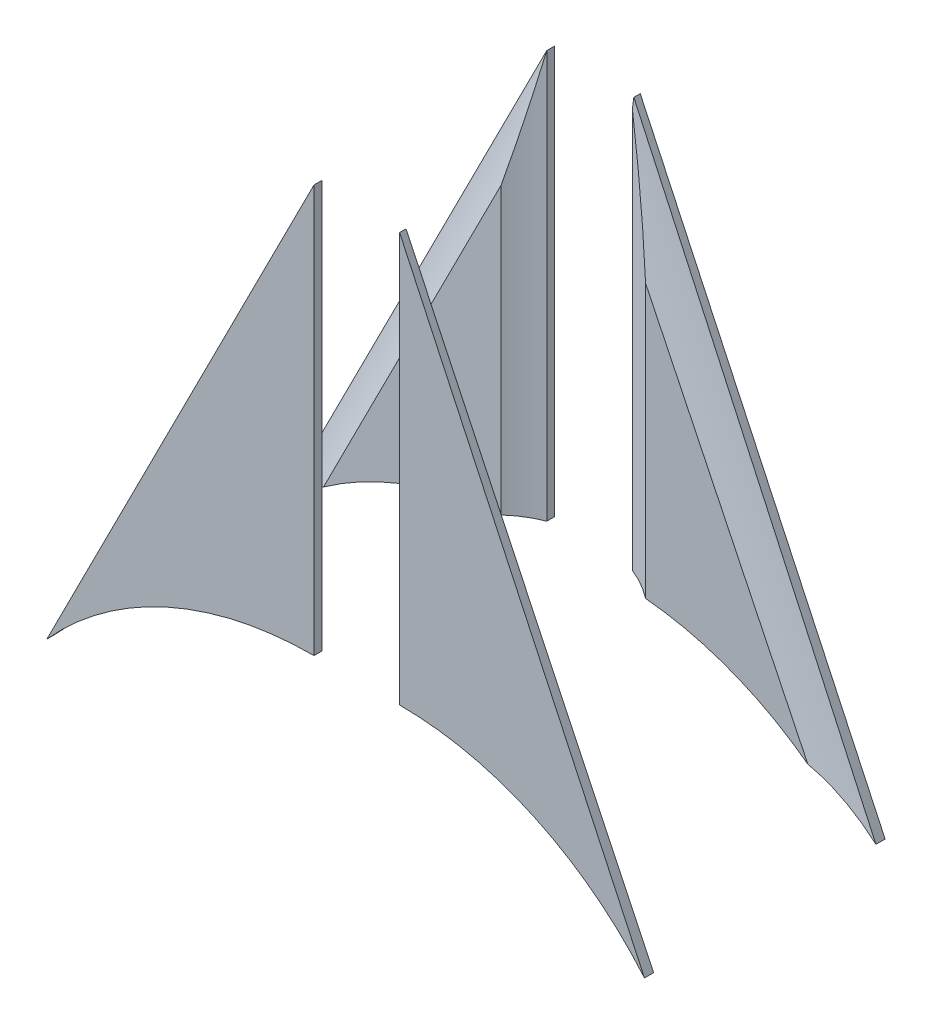
ISO-10303-21;
HEADER;
FILE_DESCRIPTION(('STEP AP214'),'2;1');
FILE_NAME('part.step','',(''),(''),'','','');
FILE_SCHEMA(('AUTOMOTIVE_DESIGN { 1 0 10303 214 1 1 1 1 }'));
ENDSEC;
DATA;
#1=APPLICATION_CONTEXT('core data for automotive mechanical design processes');
#2=APPLICATION_PROTOCOL_DEFINITION('international standard','automotive_design',2000,#1);
#3=PRODUCT_CONTEXT('',#1,'mechanical');
#4=PRODUCT('Part','Part','',(#3));
#5=PRODUCT_RELATED_PRODUCT_CATEGORY('part','',(#4));
#6=PRODUCT_DEFINITION_FORMATION('','',#4);
#7=PRODUCT_DEFINITION_CONTEXT('part definition',#1,'design');
#8=PRODUCT_DEFINITION('design','',#6,#7);
#9=PRODUCT_DEFINITION_SHAPE('','',#8);
#10=(LENGTH_UNIT() NAMED_UNIT(*) SI_UNIT(.MILLI.,.METRE.));
#11=(NAMED_UNIT(*) PLANE_ANGLE_UNIT() SI_UNIT($,.RADIAN.));
#12=(NAMED_UNIT(*) SI_UNIT($,.STERADIAN.) SOLID_ANGLE_UNIT());
#13=UNCERTAINTY_MEASURE_WITH_UNIT(LENGTH_MEASURE(1.E-05),#10,'distance_accuracy_value','');
#14=(GEOMETRIC_REPRESENTATION_CONTEXT(3) GLOBAL_UNCERTAINTY_ASSIGNED_CONTEXT((#13)) GLOBAL_UNIT_ASSIGNED_CONTEXT((#10,
#11,#12)) REPRESENTATION_CONTEXT('',''));
#15=CARTESIAN_POINT('',(0.,0.,0.));
#16=DIRECTION('',(0.,0.,1.));
#17=DIRECTION('',(1.,0.,0.));
#18=AXIS2_PLACEMENT_3D('',#15,#16,#17);
#19=CARTESIAN_POINT('',(-2.82222222222222,-23.6708987466304,-7.9375));
#20=DIRECTION('',(0.,0.,1.));
#21=DIRECTION('',(-1.,0.,0.));
#22=AXIS2_PLACEMENT_3D('',#19,#20,#21);
#23=CYLINDRICAL_SURFACE('',#22,23.6708987466304);
#24=CARTESIAN_POINT('',(-2.82222222222222,-23.6708987466304,-6.35));
#25=DIRECTION('',(0.,0.,-1.));
#26=DIRECTION('',(1.,0.,0.));
#27=AXIS2_PLACEMENT_3D('',#24,#25,#26);
#28=CIRCLE('',#27,23.6708987466304);
#29=CARTESIAN_POINT('',(-16.4791686957638,-4.33700983384184,-6.35));
#30=VERTEX_POINT('',#29);
#31=CARTESIAN_POINT('',(-4.76249999999998,-0.0796552520985656,-6.35));
#32=VERTEX_POINT('',#31);
#33=EDGE_CURVE('E164',#30,#32,#28,.T.);
#34=ORIENTED_EDGE('',*,*,#33,.F.);
#35=CARTESIAN_POINT('',(-16.4791686957638,-4.33700983384184,-6.35));
#36=CARTESIAN_POINT('',(-16.6545284019154,-4.46086256009777,-6.42526611649418));
#37=CARTESIAN_POINT('',(-16.8295827648747,-4.58810814889428,-6.49551543105102));
#38=CARTESIAN_POINT('',(-17.1782247201463,-4.8490006228776,-6.62690727443521));
#39=CARTESIAN_POINT('',(-17.3518128676449,-4.98264494439959,-6.68805341077926));
#40=CARTESIAN_POINT('',(-17.6957006735763,-5.25517272376629,-6.80185792004279));
#41=CARTESIAN_POINT('',(-17.8660142821283,-5.39401708588726,-6.85456821115581));
#42=CARTESIAN_POINT('',(-18.2039122553321,-5.67746431695201,-6.95283117131451));
#43=CARTESIAN_POINT('',(-18.3714963525424,-5.82206774545189,-6.99838314271435));
#44=CARTESIAN_POINT('',(-18.7033442952519,-6.11667925214695,-7.08309537285121));
#45=CARTESIAN_POINT('',(-18.8676096514688,-6.26668478059766,-7.12225859997793));
#46=CARTESIAN_POINT('',(-19.1924954410512,-6.57191380818712,-7.1949387527441));
#47=CARTESIAN_POINT('',(-19.3531158584304,-6.72713733020407,-7.22845565362345));
#48=CARTESIAN_POINT('',(-19.6714072921434,-7.0435991512527,-7.2907025165833));
#49=CARTESIAN_POINT('',(-19.8290521499642,-7.20487014732424,-7.31939973909409));
#50=CARTESIAN_POINT('',(-20.1400025297195,-7.53222029190118,-7.37232020329811));
#51=CARTESIAN_POINT('',(-20.2933085931518,-7.69829883512661,-7.39654400539452));
#52=CARTESIAN_POINT('',(-20.4443149669744,-7.86668112067436,-7.41882524354934));
#53=B_SPLINE_CURVE_WITH_KNOTS('',3,(#35,#36,#37,#38,#39,#40,#41,#42,#43,#44,#45,#46,#47,#48,#49,
#50,#51,#52),.UNSPECIFIED.,.F.,.F.,(4,2,2,2,2,2,2,2,4),(0.,0.682345221520637,1.36441931114423,
2.04211918016613,2.71988505653173,3.39733512138152,4.07478815688685,4.75667165985288,
5.43846968252621),.UNSPECIFIED.);
#54=CARTESIAN_POINT('',(-20.4443149669744,-7.86668112067437,-7.41882524354934));
#55=VERTEX_POINT('',#54);
#56=EDGE_CURVE('E134',#30,#55,#53,.T.);
#57=ORIENTED_EDGE('',*,*,#56,.T.);
#58=DIRECTION('',(0.,0.,1.));
#59=VECTOR('',#58,1.);
#60=CARTESIAN_POINT('',(-20.4443149669744,-7.86668112067437,-7.9375));
#61=LINE('',#60,#59);
#62=CARTESIAN_POINT('',(-20.4443149669744,-7.86668112067437,-7.9375));
#63=VERTEX_POINT('',#62);
#64=EDGE_CURVE('E132',#63,#55,#61,.T.);
#65=ORIENTED_EDGE('',*,*,#64,.F.);
#66=CARTESIAN_POINT('',(-2.82222222222222,-23.6708987466304,-7.9375));
#67=DIRECTION('',(0.,0.,-1.));
#68=DIRECTION('',(1.,0.,0.));
#69=AXIS2_PLACEMENT_3D('',#66,#67,#68);
#70=CIRCLE('',#69,23.6708987466304);
#71=CARTESIAN_POINT('',(-2.8222222222222,0.,-7.9375));
#72=VERTEX_POINT('',#71);
#73=EDGE_CURVE('E170',#63,#72,#70,.T.);
#74=ORIENTED_EDGE('',*,*,#73,.T.);
#75=DIRECTION('',(0.,0.,1.));
#76=VECTOR('',#75,1.);
#77=CARTESIAN_POINT('',(-2.8222222222222,0.,-7.9375));
#78=LINE('',#77,#76);
#79=CARTESIAN_POINT('',(-2.82222222222227,0.,-7.4188252424757));
#80=VERTEX_POINT('',#79);
#81=EDGE_CURVE('E149',#72,#80,#78,.T.);
#82=ORIENTED_EDGE('',*,*,#81,.T.);
#83=CARTESIAN_POINT('',(-2.8222222222222,0.,-7.41882524247573));
#84=CARTESIAN_POINT('',(-2.99592523344588,1.00011979534775E-05,-7.35276051486964));
#85=CARTESIAN_POINT('',(-3.16728898237306,-0.00191200073882721,-7.28057429104864));
#86=CARTESIAN_POINT('',(-3.50360817586906,-0.00921692854689364,-7.1247982334665));
#87=CARTESIAN_POINT('',(-3.668592022174,-0.0145820216710841,-7.04126889633603));
#88=CARTESIAN_POINT('',(-3.99222067000354,-0.0283777587901366,-6.86295973725627));
#89=CARTESIAN_POINT('',(-4.15086560637183,-0.0368083375362568,-6.76818015479693));
#90=CARTESIAN_POINT('',(-4.46185653505691,-0.0563371239536801,-6.56736046687277));
#91=CARTESIAN_POINT('',(-4.61416576454038,-0.0674488839122998,-6.46126473369188));
#92=CARTESIAN_POINT('',(-4.76249999999998,-0.0796552520985691,-6.35));
#93=B_SPLINE_CURVE_WITH_KNOTS('',3,(#83,#84,#85,#86,#87,#88,#89,#90,#91,#92),.UNSPECIFIED.,.F.,
.F.,(4,2,2,2,4),(0.,0.557386699182837,1.11190958059044,1.66642065969102,2.2237955496453),.UNSPECIFIED.);
#94=EDGE_CURVE('E140',#80,#32,#93,.T.);
#95=ORIENTED_EDGE('',*,*,#94,.T.);
#96=EDGE_LOOP('',(#34,#57,#65,#74,#82,#95));
#97=FACE_BOUND('',#96,.T.);
#98=ADVANCED_FACE('F68',(#97),#23,.F.);
#99=CARTESIAN_POINT('',(-2.82222222222222,26.8878111520368,-7.9375));
#100=DIRECTION('',(-1.,0.,0.));
#101=DIRECTION('',(0.,-1.,0.));
#102=AXIS2_PLACEMENT_3D('',#99,#100,#101);
#103=PLANE('',#102);
#104=DIRECTION('',(0.,0.,1.));
#105=VECTOR('',#104,1.);
#106=CARTESIAN_POINT('',(-2.82222222222222,26.8878111520368,-7.9375));
#107=LINE('',#106,#105);
#108=CARTESIAN_POINT('',(-2.82222222222222,26.8878111520368,-7.9375));
#109=VERTEX_POINT('',#108);
#110=CARTESIAN_POINT('',(-2.82222221939997,26.8878111576029,-7.41882524354934));
#111=VERTEX_POINT('',#110);
#112=EDGE_CURVE('E129',#109,#111,#107,.T.);
#113=ORIENTED_EDGE('',*,*,#112,.T.);
#114=DIRECTION('',(0.,-1.,0.));
#115=VECTOR('',#114,1.);
#116=CARTESIAN_POINT('',(-2.82222222222226,86.2990422935179,-7.4188252424757));
#117=LINE('',#116,#115);
#118=EDGE_CURVE('E137',#111,#80,#117,.T.);
#119=ORIENTED_EDGE('',*,*,#118,.T.);
#120=ORIENTED_EDGE('',*,*,#81,.F.);
#121=DIRECTION('',(0.,1.,0.));
#122=VECTOR('',#121,1.);
#123=CARTESIAN_POINT('',(-2.82222222222222,26.8878111520368,-7.9375));
#124=LINE('',#123,#122);
#125=EDGE_CURVE('E147',#72,#109,#124,.T.);
#126=ORIENTED_EDGE('',*,*,#125,.T.);
#127=EDGE_LOOP('',(#113,#119,#120,#126));
#128=FACE_BOUND('',#127,.T.);
#129=ADVANCED_FACE('F146',(#128),#103,.F.);
#130=CARTESIAN_POINT('',(-20.4443149669744,-7.86668112067437,-7.9375));
#131=DIRECTION('',(0.891899679684326,-0.452233304146207,0.));
#132=DIRECTION('',(0.452233304146207,0.891899679684326,0.));
#133=AXIS2_PLACEMENT_3D('',#130,#131,#132);
#134=PLANE('',#133);
#135=ORIENTED_EDGE('',*,*,#64,.T.);
#136=DIRECTION('',(-0.452233304146207,-0.891899679684326,0.));
#137=VECTOR('',#136,1.);
#138=CARTESIAN_POINT('',(2.51713909348085,37.4181604286899,-7.41882524354934));
#139=LINE('',#138,#137);
#140=EDGE_CURVE('E121',#55,#111,#139,.F.);
#141=ORIENTED_EDGE('',*,*,#140,.T.);
#142=ORIENTED_EDGE('',*,*,#112,.F.);
#143=DIRECTION('',(-0.452233304146207,-0.891899679684326,0.));
#144=VECTOR('',#143,1.);
#145=CARTESIAN_POINT('',(-20.4443149669744,-7.86668112067437,-7.9375));
#146=LINE('',#145,#144);
#147=EDGE_CURVE('E97',#109,#63,#146,.T.);
#148=ORIENTED_EDGE('',*,*,#147,.T.);
#149=EDGE_LOOP('',(#135,#141,#142,#148));
#150=FACE_BOUND('',#149,.T.);
#151=ADVANCED_FACE('F127',(#150),#134,.F.);
#152=CARTESIAN_POINT('',(-2.82222222222222,-23.6708987466304,-7.9375));
#153=DIRECTION('',(0.,0.,-1.));
#154=DIRECTION('',(1.,0.,0.));
#155=AXIS2_PLACEMENT_3D('',#152,#153,#154);
#156=PLANE('',#155);
#157=ORIENTED_EDGE('',*,*,#73,.F.);
#158=ORIENTED_EDGE('',*,*,#147,.F.);
#159=ORIENTED_EDGE('',*,*,#125,.F.);
#160=EDGE_LOOP('',(#157,#158,#159));
#161=FACE_BOUND('',#160,.T.);
#162=ADVANCED_FACE('F184',(#161),#156,.T.);
#163=CARTESIAN_POINT('',(-2.82222222222222,-23.6708987466304,-6.35));
#164=DIRECTION('',(0.,0.,-1.));
#165=DIRECTION('',(1.,0.,0.));
#166=AXIS2_PLACEMENT_3D('',#163,#164,#165);
#167=PLANE('',#166);
#168=DIRECTION('',(0.,-1.,0.));
#169=VECTOR('',#168,1.);
#170=CARTESIAN_POINT('',(-4.76249999999997,86.2990422935179,-6.35));
#171=LINE('',#170,#169);
#172=CARTESIAN_POINT('',(-4.76249999999998,18.7707377842783,-6.35));
#173=VERTEX_POINT('',#172);
#174=EDGE_CURVE('E77',#32,#173,#171,.F.);
#175=ORIENTED_EDGE('',*,*,#174,.T.);
#176=DIRECTION('',(-0.452233304146207,-0.891899679684326,0.));
#177=VECTOR('',#176,1.);
#178=CARTESIAN_POINT('',(4.2476722244966,36.5407021970077,-6.35));
#179=LINE('',#178,#177);
#180=EDGE_CURVE('E87',#173,#30,#179,.T.);
#181=ORIENTED_EDGE('',*,*,#180,.T.);
#182=ORIENTED_EDGE('',*,*,#33,.T.);
#183=EDGE_LOOP('',(#175,#181,#182));
#184=FACE_BOUND('',#183,.T.);
#185=ADVANCED_FACE('F162',(#184),#167,.F.);
#186=CARTESIAN_POINT('',(0.,86.2990422935179,0.));
#187=DIRECTION('',(0.,-1.,0.));
#188=DIRECTION('',(1.,0.,0.));
#189=AXIS2_PLACEMENT_3D('',#186,#187,#188);
#190=CYLINDRICAL_SURFACE('',#189,7.9375);
#191=ORIENTED_EDGE('',*,*,#118,.F.);
#192=CARTESIAN_POINT('',(0.,38.694463308004,0.));
#193=DIRECTION('',(0.972599526959664,-0.232486903196367,0.));
#194=DIRECTION('',(-0.232486903196367,-0.972599526959664,0.));
#195=AXIS2_PLACEMENT_3D('',#192,#193,#194);
#196=ELLIPSE('',#195,34.1417081602042,7.9375);
#197=EDGE_CURVE('E13',#111,#173,#196,.F.);
#198=ORIENTED_EDGE('',*,*,#197,.T.);
#199=ORIENTED_EDGE('',*,*,#174,.F.);
#200=ORIENTED_EDGE('',*,*,#94,.F.);
#201=EDGE_LOOP('',(#191,#198,#199,#200));
#202=FACE_BOUND('',#201,.T.);
#203=ADVANCED_FACE('F138',(#202),#190,.F.);
#204=CARTESIAN_POINT('',(0.,38.694463308004,0.));
#205=DIRECTION('',(-0.452233304146207,-0.891899679684326,0.));
#206=DIRECTION('',(0.891899679684326,-0.452233304146207,0.));
#207=AXIS2_PLACEMENT_3D('',#204,#205,#206);
#208=CYLINDRICAL_SURFACE('',#207,7.9375);
#209=ORIENTED_EDGE('',*,*,#180,.F.);
#210=ORIENTED_EDGE('',*,*,#197,.F.);
#211=ORIENTED_EDGE('',*,*,#140,.F.);
#212=ORIENTED_EDGE('',*,*,#56,.F.);
#213=EDGE_LOOP('',(#209,#210,#211,#212));
#214=FACE_BOUND('',#213,.T.);
#215=ADVANCED_FACE('F120',(#214),#208,.F.);
#216=CLOSED_SHELL('',(#98,#129,#151,#162,#185,#203,#215));
#217=MANIFOLD_SOLID_BREP('B2',#216);
#218=CARTESIAN_POINT('',(2.82222222222222,-21.114080449228,-7.9375));
#219=DIRECTION('',(0.,0.,1.));
#220=DIRECTION('',(-1.,0.,0.));
#221=AXIS2_PLACEMENT_3D('',#218,#219,#220);
#222=CYLINDRICAL_SURFACE('',#221,21.114080449228);
#223=DIRECTION('',(0.,0.,1.));
#224=VECTOR('',#223,1.);
#225=CARTESIAN_POINT('',(18.976219439284,-7.51802340581895,-7.9375));
#226=LINE('',#225,#224);
#227=CARTESIAN_POINT('',(18.976219439284,-7.51802340581895,-7.9375));
#228=VERTEX_POINT('',#227);
#229=CARTESIAN_POINT('',(18.976219439284,-7.51802340581895,-7.33049476941848));
#230=VERTEX_POINT('',#229);
#231=EDGE_CURVE('E326',#228,#230,#226,.T.);
#232=ORIENTED_EDGE('',*,*,#231,.T.);
#233=CARTESIAN_POINT('',(18.976219439284,-7.51802340581895,-7.33049476941848));
#234=CARTESIAN_POINT('',(18.8437164971824,-7.36058548627625,-7.30942358651429));
#235=CARTESIAN_POINT('',(18.7090180445645,-7.2052226059667,-7.28656240073076));
#236=CARTESIAN_POINT('',(18.4354661900463,-6.89883713218853,-7.23677924927139));
#237=CARTESIAN_POINT('',(18.296612326124,-6.74781502503866,-7.20985683069004));
#238=CARTESIAN_POINT('',(18.0159133048431,-6.45128507586411,-7.1516610850989));
#239=CARTESIAN_POINT('',(17.8740928704587,-6.30574821021713,-7.12041659949753));
#240=CARTESIAN_POINT('',(17.5869147721722,-6.01940060058214,-7.05291117352708));
#241=CARTESIAN_POINT('',(17.4415571307033,-5.87858982663457,-7.0166502649655));
#242=CARTESIAN_POINT('',(17.1475999737529,-5.60186901299707,-6.93850898765317));
#243=CARTESIAN_POINT('',(16.9989991956328,-5.46596093872596,-6.89662639633039));
#244=CARTESIAN_POINT('',(16.6990510155313,-5.19936142530037,-6.80661286644771));
#245=CARTESIAN_POINT('',(16.5477038339178,-5.06866957027185,-6.7584824273169));
#246=CARTESIAN_POINT('',(16.2417866175542,-4.81194039734671,-6.65495131170017));
#247=CARTESIAN_POINT('',(16.0872022274714,-4.68593787120068,-6.59950644621144));
#248=CARTESIAN_POINT('',(15.7763512890853,-4.43971719426204,-6.48080318633887));
#249=CARTESIAN_POINT('',(15.620084201091,-4.31950097128188,-6.41754221257428));
#250=CARTESIAN_POINT('',(15.463328249719,-4.20234394412428,-6.35));
#251=B_SPLINE_CURVE_WITH_KNOTS('',3,(#233,#234,#235,#236,#237,#238,#239,#240,#241,#242,#243,
#244,#245,#246,#247,#248,#249,#250),.UNSPECIFIED.,.F.,.F.,(4,2,2,2,2,2,2,2,4),(0.,
0.620540139430094,1.24114953224086,1.85780118858621,2.47444893512351,3.09134119977859,
3.70818418275462,4.32894075948304,4.94990274096788),.UNSPECIFIED.);
#252=CARTESIAN_POINT('',(15.4633282497189,-4.20234394412426,-6.35));
#253=VERTEX_POINT('',#252);
#254=EDGE_CURVE('E363',#230,#253,#251,.T.);
#255=ORIENTED_EDGE('',*,*,#254,.T.);
#256=CARTESIAN_POINT('',(2.82222222222222,-21.114080449228,-6.35));
#257=DIRECTION('',(0.,0.,-1.));
#258=DIRECTION('',(-1.,0.,0.));
#259=AXIS2_PLACEMENT_3D('',#256,#257,#258);
#260=CIRCLE('',#259,21.114080449228);
#261=CARTESIAN_POINT('',(4.76250000000002,-0.089339895263163,-6.35));
#262=VERTEX_POINT('',#261);
#263=EDGE_CURVE('E321',#262,#253,#260,.T.);
#264=ORIENTED_EDGE('',*,*,#263,.F.);
#265=CARTESIAN_POINT('',(4.76250000000002,-0.089339895263163,-6.35));
#266=CARTESIAN_POINT('',(4.61421358411622,-0.0756479632866591,-6.46122907788727));
#267=CARTESIAN_POINT('',(4.4619378595739,-0.0631845660562414,-6.56730464384498));
#268=CARTESIAN_POINT('',(4.15099596564056,-0.0412817521191013,-6.76809926139033));
#269=CARTESIAN_POINT('',(3.99236719307374,-0.0318269299498871,-6.86287456153188));
#270=CARTESIAN_POINT('',(3.668742745119,-0.0163549126635673,-7.04119029428164));
#271=CARTESIAN_POINT('',(3.50374689967418,-0.0103378094317618,-7.1247304265443));
#272=CARTESIAN_POINT('',(3.16737500902741,-0.00214462376370144,-7.28053801973534));
#273=CARTESIAN_POINT('',(2.99597009329015,1.11927930437792E-05,-7.35274419984045));
#274=CARTESIAN_POINT('',(2.82222222222222,0.,-7.41882524247574));
#275=B_SPLINE_CURVE_WITH_KNOTS('',3,(#265,#266,#267,#268,#269,#270,#271,#272,#273,#274),
.UNSPECIFIED.,.F.,.F.,(4,2,2,2,4),(0.,0.557509229948387,1.11211598819303,1.66673756958802,
2.22426163397649),.UNSPECIFIED.);
#276=CARTESIAN_POINT('',(2.82222222222223,0.,-7.41882524247574));
#277=VERTEX_POINT('',#276);
#278=EDGE_CURVE('E286',#262,#277,#275,.T.);
#279=ORIENTED_EDGE('',*,*,#278,.T.);
#280=DIRECTION('',(0.,0.,1.));
#281=VECTOR('',#280,1.);
#282=CARTESIAN_POINT('',(2.82222222222222,0.,-7.9375));
#283=LINE('',#282,#281);
#284=CARTESIAN_POINT('',(2.82222222222222,0.,-7.9375));
#285=VERTEX_POINT('',#284);
#286=EDGE_CURVE('E337',#285,#277,#283,.T.);
#287=ORIENTED_EDGE('',*,*,#286,.F.);
#288=CARTESIAN_POINT('',(2.82222222222222,-21.114080449228,-7.9375));
#289=DIRECTION('',(0.,0.,-1.));
#290=DIRECTION('',(-1.,0.,0.));
#291=AXIS2_PLACEMENT_3D('',#288,#289,#290);
#292=CIRCLE('',#291,21.114080449228);
#293=EDGE_CURVE('E344',#285,#228,#292,.T.);
#294=ORIENTED_EDGE('',*,*,#293,.T.);
#295=EDGE_LOOP('',(#232,#255,#264,#279,#287,#294));
#296=FACE_BOUND('',#295,.T.);
#297=ADVANCED_FACE('F257',(#296),#222,.F.);
#298=CARTESIAN_POINT('',(2.82222222222222,26.989428429131,-7.9375));
#299=DIRECTION('',(-0.90567437482675,-0.423973969462955,0.));
#300=DIRECTION('',(0.423973969462955,-0.90567437482675,0.));
#301=AXIS2_PLACEMENT_3D('',#298,#299,#300);
#302=PLANE('',#301);
#303=DIRECTION('',(0.,0.,1.));
#304=VECTOR('',#303,1.);
#305=CARTESIAN_POINT('',(2.82222222222222,26.989428429131,-7.9375));
#306=LINE('',#305,#304);
#307=CARTESIAN_POINT('',(2.82222222222222,26.989428429131,-7.9375));
#308=VERTEX_POINT('',#307);
#309=CARTESIAN_POINT('',(2.82222222222222,26.989428429131,-7.51428455318159));
#310=VERTEX_POINT('',#309);
#311=EDGE_CURVE('E331',#308,#310,#306,.T.);
#312=ORIENTED_EDGE('',*,*,#311,.T.);
#313=CARTESIAN_POINT('',(-81.9906245231497,208.162867097288,0.));
#314=DIRECTION('',(-0.90567437482675,-0.423973969462955,0.));
#315=DIRECTION('',(-0.423973969462955,0.905674374826751,0.));
#316=AXIS2_PLACEMENT_3D('',#313,#314,#315);
#317=ELLIPSE('',#316,620.920656994149,7.93749999999999);
#318=EDGE_CURVE('E393',#310,#230,#317,.T.);
#319=ORIENTED_EDGE('',*,*,#318,.T.);
#320=ORIENTED_EDGE('',*,*,#231,.F.);
#321=DIRECTION('',(-0.423973969462955,0.90567437482675,0.));
#322=VECTOR('',#321,1.);
#323=CARTESIAN_POINT('',(2.82222222222222,26.989428429131,-7.9375));
#324=LINE('',#323,#322);
#325=EDGE_CURVE('E348',#228,#308,#324,.T.);
#326=ORIENTED_EDGE('',*,*,#325,.T.);
#327=EDGE_LOOP('',(#312,#319,#320,#326));
#328=FACE_BOUND('',#327,.T.);
#329=ADVANCED_FACE('F382',(#328),#302,.F.);
#330=CARTESIAN_POINT('',(2.82222222222222,0.,-7.9375));
#331=DIRECTION('',(1.,0.,0.));
#332=DIRECTION('',(0.,0.,1.));
#333=AXIS2_PLACEMENT_3D('',#330,#331,#332);
#334=PLANE('',#333);
#335=DIRECTION('',(0.,-1.,0.));
#336=VECTOR('',#335,1.);
#337=CARTESIAN_POINT('',(2.82222222222222,86.2990422935179,-7.41882524247574));
#338=LINE('',#337,#336);
#339=CARTESIAN_POINT('',(2.82222222222221,26.380977873178,-7.41882524247574));
#340=VERTEX_POINT('',#339);
#341=EDGE_CURVE('E345',#277,#340,#338,.F.);
#342=ORIENTED_EDGE('',*,*,#341,.T.);
#343=CARTESIAN_POINT('',(2.82222222222224,32.8611439752111,0.));
#344=DIRECTION('',(1.,0.,0.));
#345=DIRECTION('',(0.,1.,0.));
#346=AXIS2_PLACEMENT_3D('',#343,#344,#345);
#347=ELLIPSE('',#346,18.2254671619682,7.93749999999999);
#348=EDGE_CURVE('E276',#340,#310,#347,.T.);
#349=ORIENTED_EDGE('',*,*,#348,.T.);
#350=ORIENTED_EDGE('',*,*,#311,.F.);
#351=DIRECTION('',(0.,-1.,0.));
#352=VECTOR('',#351,1.);
#353=CARTESIAN_POINT('',(2.82222222222222,0.,-7.9375));
#354=LINE('',#353,#352);
#355=EDGE_CURVE('E341',#308,#285,#354,.T.);
#356=ORIENTED_EDGE('',*,*,#355,.T.);
#357=ORIENTED_EDGE('',*,*,#286,.T.);
#358=EDGE_LOOP('',(#342,#349,#350,#356,#357));
#359=FACE_BOUND('',#358,.T.);
#360=ADVANCED_FACE('F377',(#359),#334,.F.);
#361=CARTESIAN_POINT('',(2.82222222222222,-21.114080449228,-7.9375));
#362=DIRECTION('',(0.,0.,1.));
#363=DIRECTION('',(-1.,0.,0.));
#364=AXIS2_PLACEMENT_3D('',#361,#362,#363);
#365=PLANE('',#364);
#366=ORIENTED_EDGE('',*,*,#293,.F.);
#367=ORIENTED_EDGE('',*,*,#355,.F.);
#368=ORIENTED_EDGE('',*,*,#325,.F.);
#369=EDGE_LOOP('',(#366,#367,#368));
#370=FACE_BOUND('',#369,.T.);
#371=ADVANCED_FACE('F374',(#370),#365,.F.);
#372=CARTESIAN_POINT('',(2.82222222222222,-21.114080449228,-6.35));
#373=DIRECTION('',(0.,0.,1.));
#374=DIRECTION('',(-1.,0.,0.));
#375=AXIS2_PLACEMENT_3D('',#372,#373,#374);
#376=PLANE('',#375);
#377=DIRECTION('',(-0.435516957094164,0.900180526385369,0.));
#378=VECTOR('',#377,1.);
#379=CARTESIAN_POINT('',(109.884939270642,-199.364654220351,-6.35));
#380=LINE('',#379,#378);
#381=CARTESIAN_POINT('',(4.76250000000003,17.9154566367351,-6.35));
#382=VERTEX_POINT('',#381);
#383=EDGE_CURVE('E314',#382,#253,#380,.F.);
#384=ORIENTED_EDGE('',*,*,#383,.F.);
#385=DIRECTION('',(0.,-1.,0.));
#386=VECTOR('',#385,1.);
#387=CARTESIAN_POINT('',(4.76250000000003,86.2990422935179,-6.35));
#388=LINE('',#387,#386);
#389=EDGE_CURVE('E266',#262,#382,#388,.F.);
#390=ORIENTED_EDGE('',*,*,#389,.F.);
#391=ORIENTED_EDGE('',*,*,#263,.T.);
#392=EDGE_LOOP('',(#384,#390,#391));
#393=FACE_BOUND('',#392,.T.);
#394=ADVANCED_FACE('F319',(#393),#376,.T.);
#395=CARTESIAN_POINT('',(0.,86.2990422935179,0.));
#396=DIRECTION('',(0.,-1.,0.));
#397=DIRECTION('',(1.,0.,0.));
#398=AXIS2_PLACEMENT_3D('',#395,#396,#397);
#399=CYLINDRICAL_SURFACE('',#398,7.9375);
#400=ORIENTED_EDGE('',*,*,#389,.T.);
#401=CARTESIAN_POINT('',(0.,38.6944633080038,0.));
#402=DIRECTION('',(-0.974725737421909,-0.223404871941763,0.));
#403=DIRECTION('',(0.223404871941763,-0.974725737421909,0.));
#404=AXIS2_PLACEMENT_3D('',#401,#402,#403);
#405=ELLIPSE('',#404,35.5296638386165,7.9375);
#406=EDGE_CURVE('E66',#382,#340,#405,.F.);
#407=ORIENTED_EDGE('',*,*,#406,.T.);
#408=ORIENTED_EDGE('',*,*,#341,.F.);
#409=ORIENTED_EDGE('',*,*,#278,.F.);
#410=EDGE_LOOP('',(#400,#407,#408,#409));
#411=FACE_BOUND('',#410,.T.);
#412=ADVANCED_FACE('F324',(#411),#399,.F.);
#413=CARTESIAN_POINT('',(114.172049027553,-197.29050471219,0.));
#414=DIRECTION('',(-0.435516957094164,0.900180526385369,0.));
#415=DIRECTION('',(-0.900180526385369,-0.435516957094164,0.));
#416=AXIS2_PLACEMENT_3D('',#413,#414,#415);
#417=CYLINDRICAL_SURFACE('',#416,7.93749999999999);
#418=ORIENTED_EDGE('',*,*,#318,.F.);
#419=ORIENTED_EDGE('',*,*,#348,.F.);
#420=ORIENTED_EDGE('',*,*,#406,.F.);
#421=ORIENTED_EDGE('',*,*,#383,.T.);
#422=ORIENTED_EDGE('',*,*,#254,.F.);
#423=EDGE_LOOP('',(#418,#419,#420,#421,#422));
#424=FACE_BOUND('',#423,.T.);
#425=ADVANCED_FACE('F313',(#424),#417,.F.);
#426=CLOSED_SHELL('',(#297,#329,#360,#371,#394,#412,#425));
#427=MANIFOLD_SOLID_BREP('B7',#426);
#428=CARTESIAN_POINT('',(2.82222222222222,-21.114080449228,7.9375));
#429=DIRECTION('',(0.,0.,-1.));
#430=DIRECTION('',(-1.,0.,0.));
#431=AXIS2_PLACEMENT_3D('',#428,#429,#430);
#432=CYLINDRICAL_SURFACE('',#431,21.114080449228);
#433=CARTESIAN_POINT('',(2.82222222222222,-21.114080449228,6.35));
#434=DIRECTION('',(0.,0.,-1.));
#435=DIRECTION('',(-1.,0.,0.));
#436=AXIS2_PLACEMENT_3D('',#433,#434,#435);
#437=CIRCLE('',#436,21.114080449228);
#438=CARTESIAN_POINT('',(4.76250000000002,-0.089339895263163,6.35));
#439=VERTEX_POINT('',#438);
#440=CARTESIAN_POINT('',(15.4633282497189,-4.20234394412426,6.35));
#441=VERTEX_POINT('',#440);
#442=EDGE_CURVE('E534',#439,#441,#437,.T.);
#443=ORIENTED_EDGE('',*,*,#442,.T.);
#444=CARTESIAN_POINT('',(15.463328249719,-4.20234394412428,6.35));
#445=CARTESIAN_POINT('',(15.620084201091,-4.31950097128188,6.41754221257428));
#446=CARTESIAN_POINT('',(15.7763512890853,-4.43971719426204,6.48080318633887));
#447=CARTESIAN_POINT('',(16.0872022274714,-4.68593787120068,6.59950644621144));
#448=CARTESIAN_POINT('',(16.2417866175542,-4.8119403973467,6.65495131170017));
#449=CARTESIAN_POINT('',(16.5477038339178,-5.06866957027184,6.7584824273169));
#450=CARTESIAN_POINT('',(16.6990510155313,-5.19936142530036,6.80661286644772));
#451=CARTESIAN_POINT('',(16.9989991956328,-5.46596093872596,6.8966263963304));
#452=CARTESIAN_POINT('',(17.1475999737529,-5.60186901299706,6.93850898765317));
#453=CARTESIAN_POINT('',(17.4415571307033,-5.87858982663457,7.0166502649655));
#454=CARTESIAN_POINT('',(17.5869147721722,-6.01940060058214,7.05291117352708));
#455=CARTESIAN_POINT('',(17.8740928704587,-6.30574821021713,7.12041659949753));
#456=CARTESIAN_POINT('',(18.0159133048431,-6.45128507586411,7.1516610850989));
#457=CARTESIAN_POINT('',(18.296612326124,-6.74781502503865,7.20985683069004));
#458=CARTESIAN_POINT('',(18.4354661900463,-6.89883713218852,7.2367792492714));
#459=CARTESIAN_POINT('',(18.7090180445645,-7.20522260596669,7.28656240073077));
#460=CARTESIAN_POINT('',(18.8437164971824,-7.36058548627625,7.3094235865143));
#461=CARTESIAN_POINT('',(18.976219439284,-7.51802340581895,7.33049476941848));
#462=B_SPLINE_CURVE_WITH_KNOTS('',3,(#444,#445,#446,#447,#448,#449,#450,#451,#452,#453,#454,
#455,#456,#457,#458,#459,#460,#461),.UNSPECIFIED.,.F.,.F.,(4,2,2,2,2,2,2,2,4),(0.,
0.620961981484838,1.24171855821326,1.85856154118929,2.47545380584438,3.09210155238167,
3.70875320872702,4.32936260153778,4.94990274096788),.UNSPECIFIED.);
#463=CARTESIAN_POINT('',(18.976219439284,-7.51802340581895,7.33049476941848));
#464=VERTEX_POINT('',#463);
#465=EDGE_CURVE('E541',#441,#464,#462,.T.);
#466=ORIENTED_EDGE('',*,*,#465,.T.);
#467=DIRECTION('',(0.,0.,-1.));
#468=VECTOR('',#467,1.);
#469=CARTESIAN_POINT('',(18.976219439284,-7.51802340581895,7.9375));
#470=LINE('',#469,#468);
#471=CARTESIAN_POINT('',(18.976219439284,-7.51802340581895,7.9375));
#472=VERTEX_POINT('',#471);
#473=EDGE_CURVE('E562',#472,#464,#470,.T.);
#474=ORIENTED_EDGE('',*,*,#473,.F.);
#475=CARTESIAN_POINT('',(2.82222222222222,-21.114080449228,7.9375));
#476=DIRECTION('',(0.,0.,-1.));
#477=DIRECTION('',(-1.,0.,0.));
#478=AXIS2_PLACEMENT_3D('',#475,#476,#477);
#479=CIRCLE('',#478,21.114080449228);
#480=CARTESIAN_POINT('',(2.82222222222222,0.,7.9375));
#481=VERTEX_POINT('',#480);
#482=EDGE_CURVE('E539',#481,#472,#479,.T.);
#483=ORIENTED_EDGE('',*,*,#482,.F.);
#484=DIRECTION('',(0.,0.,-1.));
#485=VECTOR('',#484,1.);
#486=CARTESIAN_POINT('',(2.82222222222222,0.,7.9375));
#487=LINE('',#486,#485);
#488=CARTESIAN_POINT('',(2.82222222222222,0.,7.41882524247574));
#489=VERTEX_POINT('',#488);
#490=EDGE_CURVE('E556',#481,#489,#487,.T.);
#491=ORIENTED_EDGE('',*,*,#490,.T.);
#492=CARTESIAN_POINT('',(2.82222222222222,0.,7.41882524247574));
#493=CARTESIAN_POINT('',(2.99597009329015,1.1192793039593E-05,7.35274419984046));
#494=CARTESIAN_POINT('',(3.1673750090274,-0.00214462376370555,7.28053801973535));
#495=CARTESIAN_POINT('',(3.50374689967418,-0.0103378094317634,7.1247304265443));
#496=CARTESIAN_POINT('',(3.668742745119,-0.0163549126635666,7.04119029428165));
#497=CARTESIAN_POINT('',(3.99236719307374,-0.0318269299498863,6.86287456153188));
#498=CARTESIAN_POINT('',(4.15099596564056,-0.0412817521191026,6.76809926139033));
#499=CARTESIAN_POINT('',(4.4619378595739,-0.0631845660562449,6.56730464384498));
#500=CARTESIAN_POINT('',(4.61421358411622,-0.0756479632866626,6.46122907788727));
#501=CARTESIAN_POINT('',(4.76250000000002,-0.0893398952631618,6.35));
#502=B_SPLINE_CURVE_WITH_KNOTS('',3,(#492,#493,#494,#495,#496,#497,#498,#499,#500,#501),
.UNSPECIFIED.,.F.,.F.,(4,2,2,2,4),(0.,0.557524064388471,1.11214564578346,1.6667524040281,
2.22426163397649),.UNSPECIFIED.);
#503=EDGE_CURVE('E531',#489,#439,#502,.T.);
#504=ORIENTED_EDGE('',*,*,#503,.T.);
#505=EDGE_LOOP('',(#443,#466,#474,#483,#491,#504));
#506=FACE_BOUND('',#505,.T.);
#507=ADVANCED_FACE('F457',(#506),#432,.F.);
#508=CARTESIAN_POINT('',(2.82222222222222,26.989428429131,7.9375));
#509=DIRECTION('',(-0.90567437482675,-0.423973969462955,0.));
#510=DIRECTION('',(0.423973969462955,-0.90567437482675,0.));
#511=AXIS2_PLACEMENT_3D('',#508,#509,#510);
#512=PLANE('',#511);
#513=ORIENTED_EDGE('',*,*,#473,.T.);
#514=CARTESIAN_POINT('',(-81.9906245231497,208.162867097288,0.));
#515=DIRECTION('',(-0.90567437482675,-0.423973969462955,0.));
#516=DIRECTION('',(-0.423973969462955,0.905674374826751,0.));
#517=AXIS2_PLACEMENT_3D('',#514,#515,#516);
#518=ELLIPSE('',#517,620.920656994149,7.93749999999999);
#519=CARTESIAN_POINT('',(2.82222222222222,26.989428429131,7.51428455318159));
#520=VERTEX_POINT('',#519);
#521=EDGE_CURVE('E527',#464,#520,#518,.T.);
#522=ORIENTED_EDGE('',*,*,#521,.T.);
#523=DIRECTION('',(0.,0.,-1.));
#524=VECTOR('',#523,1.);
#525=CARTESIAN_POINT('',(2.82222222222222,26.989428429131,7.9375));
#526=LINE('',#525,#524);
#527=CARTESIAN_POINT('',(2.82222222222222,26.989428429131,7.9375));
#528=VERTEX_POINT('',#527);
#529=EDGE_CURVE('E525',#528,#520,#526,.T.);
#530=ORIENTED_EDGE('',*,*,#529,.F.);
#531=DIRECTION('',(-0.423973969462955,0.90567437482675,0.));
#532=VECTOR('',#531,1.);
#533=CARTESIAN_POINT('',(2.82222222222222,26.989428429131,7.9375));
#534=LINE('',#533,#532);
#535=EDGE_CURVE('E552',#472,#528,#534,.T.);
#536=ORIENTED_EDGE('',*,*,#535,.F.);
#537=EDGE_LOOP('',(#513,#522,#530,#536));
#538=FACE_BOUND('',#537,.T.);
#539=ADVANCED_FACE('F593',(#538),#512,.F.);
#540=CARTESIAN_POINT('',(2.82222222222222,0.,7.9375));
#541=DIRECTION('',(1.,0.,0.));
#542=DIRECTION('',(0.,0.,-1.));
#543=AXIS2_PLACEMENT_3D('',#540,#541,#542);
#544=PLANE('',#543);
#545=ORIENTED_EDGE('',*,*,#529,.T.);
#546=CARTESIAN_POINT('',(2.82222222222224,32.8611439752111,0.));
#547=DIRECTION('',(1.,0.,0.));
#548=DIRECTION('',(0.,1.,0.));
#549=AXIS2_PLACEMENT_3D('',#546,#547,#548);
#550=ELLIPSE('',#549,18.2254671619682,7.93749999999999);
#551=CARTESIAN_POINT('',(2.82222222222221,26.380977873178,7.41882524247574));
#552=VERTEX_POINT('',#551);
#553=EDGE_CURVE('E514',#520,#552,#550,.T.);
#554=ORIENTED_EDGE('',*,*,#553,.T.);
#555=DIRECTION('',(0.,-1.,0.));
#556=VECTOR('',#555,1.);
#557=CARTESIAN_POINT('',(2.82222222222222,86.2990422935179,7.41882524247574));
#558=LINE('',#557,#556);
#559=EDGE_CURVE('E522',#552,#489,#558,.T.);
#560=ORIENTED_EDGE('',*,*,#559,.T.);
#561=ORIENTED_EDGE('',*,*,#490,.F.);
#562=DIRECTION('',(0.,-1.,0.));
#563=VECTOR('',#562,1.);
#564=CARTESIAN_POINT('',(2.82222222222222,0.,7.9375));
#565=LINE('',#564,#563);
#566=EDGE_CURVE('E486',#528,#481,#565,.T.);
#567=ORIENTED_EDGE('',*,*,#566,.F.);
#568=EDGE_LOOP('',(#545,#554,#560,#561,#567));
#569=FACE_BOUND('',#568,.T.);
#570=ADVANCED_FACE('F521',(#569),#544,.F.);
#571=CARTESIAN_POINT('',(2.82222222222222,-21.114080449228,7.9375));
#572=DIRECTION('',(0.,0.,-1.));
#573=DIRECTION('',(-1.,0.,0.));
#574=AXIS2_PLACEMENT_3D('',#571,#572,#573);
#575=PLANE('',#574);
#576=ORIENTED_EDGE('',*,*,#482,.T.);
#577=ORIENTED_EDGE('',*,*,#535,.T.);
#578=ORIENTED_EDGE('',*,*,#566,.T.);
#579=EDGE_LOOP('',(#576,#577,#578));
#580=FACE_BOUND('',#579,.T.);
#581=ADVANCED_FACE('F587',(#580),#575,.F.);
#582=CARTESIAN_POINT('',(2.82222222222222,-21.114080449228,6.35));
#583=DIRECTION('',(0.,0.,-1.));
#584=DIRECTION('',(-1.,0.,0.));
#585=AXIS2_PLACEMENT_3D('',#582,#583,#584);
#586=PLANE('',#585);
#587=DIRECTION('',(-0.435516957094164,0.900180526385369,0.));
#588=VECTOR('',#587,1.);
#589=CARTESIAN_POINT('',(109.884939270642,-199.364654220351,6.35));
#590=LINE('',#589,#588);
#591=CARTESIAN_POINT('',(4.76250000000003,17.9154566367351,6.35));
#592=VERTEX_POINT('',#591);
#593=EDGE_CURVE('E476',#441,#592,#590,.T.);
#594=ORIENTED_EDGE('',*,*,#593,.F.);
#595=ORIENTED_EDGE('',*,*,#442,.F.);
#596=DIRECTION('',(0.,-1.,0.));
#597=VECTOR('',#596,1.);
#598=CARTESIAN_POINT('',(4.76250000000003,86.2990422935179,6.35));
#599=LINE('',#598,#597);
#600=EDGE_CURVE('E466',#592,#439,#599,.T.);
#601=ORIENTED_EDGE('',*,*,#600,.F.);
#602=EDGE_LOOP('',(#594,#595,#601));
#603=FACE_BOUND('',#602,.T.);
#604=ADVANCED_FACE('F572',(#603),#586,.T.);
#605=CARTESIAN_POINT('',(0.,86.2990422935179,0.));
#606=DIRECTION('',(0.,-1.,0.));
#607=DIRECTION('',(1.,0.,0.));
#608=AXIS2_PLACEMENT_3D('',#605,#606,#607);
#609=CYLINDRICAL_SURFACE('',#608,7.9375);
#610=ORIENTED_EDGE('',*,*,#559,.F.);
#611=CARTESIAN_POINT('',(0.,38.6944633080038,0.));
#612=DIRECTION('',(-0.974725737421909,-0.223404871941763,0.));
#613=DIRECTION('',(0.223404871941763,-0.974725737421909,0.));
#614=AXIS2_PLACEMENT_3D('',#611,#612,#613);
#615=ELLIPSE('',#614,35.5296638386165,7.9375);
#616=EDGE_CURVE('E255',#552,#592,#615,.F.);
#617=ORIENTED_EDGE('',*,*,#616,.T.);
#618=ORIENTED_EDGE('',*,*,#600,.T.);
#619=ORIENTED_EDGE('',*,*,#503,.F.);
#620=EDGE_LOOP('',(#610,#617,#618,#619));
#621=FACE_BOUND('',#620,.T.);
#622=ADVANCED_FACE('F529',(#621),#609,.F.);
#623=CARTESIAN_POINT('',(114.172049027553,-197.29050471219,0.));
#624=DIRECTION('',(-0.435516957094164,0.900180526385369,0.));
#625=DIRECTION('',(-0.900180526385369,-0.435516957094164,0.));
#626=AXIS2_PLACEMENT_3D('',#623,#624,#625);
#627=CYLINDRICAL_SURFACE('',#626,7.93749999999999);
#628=ORIENTED_EDGE('',*,*,#593,.T.);
#629=ORIENTED_EDGE('',*,*,#616,.F.);
#630=ORIENTED_EDGE('',*,*,#553,.F.);
#631=ORIENTED_EDGE('',*,*,#521,.F.);
#632=ORIENTED_EDGE('',*,*,#465,.F.);
#633=EDGE_LOOP('',(#628,#629,#630,#631,#632));
#634=FACE_BOUND('',#633,.T.);
#635=ADVANCED_FACE('F513',(#634),#627,.F.);
#636=CLOSED_SHELL('',(#507,#539,#570,#581,#604,#622,#635));
#637=MANIFOLD_SOLID_BREP('B60',#636);
#638=CARTESIAN_POINT('',(-2.82222222222222,-23.6708987466304,7.9375));
#639=DIRECTION('',(0.,0.,-1.));
#640=DIRECTION('',(-1.,0.,0.));
#641=AXIS2_PLACEMENT_3D('',#638,#639,#640);
#642=CYLINDRICAL_SURFACE('',#641,23.6708987466304);
#643=DIRECTION('',(0.,0.,-1.));
#644=VECTOR('',#643,1.);
#645=CARTESIAN_POINT('',(-20.4443149669744,-7.86668112067437,7.9375));
#646=LINE('',#645,#644);
#647=CARTESIAN_POINT('',(-20.4443149669744,-7.86668112067437,7.9375));
#648=VERTEX_POINT('',#647);
#649=CARTESIAN_POINT('',(-20.4443149669744,-7.86668112067437,7.41882524354934));
#650=VERTEX_POINT('',#649);
#651=EDGE_CURVE('E730',#648,#650,#646,.T.);
#652=ORIENTED_EDGE('',*,*,#651,.T.);
#653=CARTESIAN_POINT('',(-20.4443149669744,-7.86668112067437,7.41882524354934));
#654=CARTESIAN_POINT('',(-20.2933085931518,-7.69829883512663,7.39654400539451));
#655=CARTESIAN_POINT('',(-20.1400025297195,-7.53222029190119,7.37232020329811));
#656=CARTESIAN_POINT('',(-19.8290521499642,-7.20487014732425,7.31939973909409));
#657=CARTESIAN_POINT('',(-19.6714072921434,-7.0435991512527,7.2907025165833));
#658=CARTESIAN_POINT('',(-19.3531158584304,-6.72713733020407,7.22845565362345));
#659=CARTESIAN_POINT('',(-19.1924954410512,-6.57191380818712,7.1949387527441));
#660=CARTESIAN_POINT('',(-18.8676096514688,-6.26668478059766,7.12225859997793));
#661=CARTESIAN_POINT('',(-18.7033442952519,-6.11667925214695,7.08309537285121));
#662=CARTESIAN_POINT('',(-18.3714963525424,-5.8220677454519,6.99838314271435));
#663=CARTESIAN_POINT('',(-18.2039122553321,-5.67746431695201,6.95283117131451));
#664=CARTESIAN_POINT('',(-17.8660142821283,-5.39401708588727,6.85456821115581));
#665=CARTESIAN_POINT('',(-17.6957006735764,-5.25517272376629,6.8018579200428));
#666=CARTESIAN_POINT('',(-17.3518128676449,-4.98264494439959,6.68805341077926));
#667=CARTESIAN_POINT('',(-17.1782247201463,-4.8490006228776,6.62690727443521));
#668=CARTESIAN_POINT('',(-16.8295827648747,-4.58810814889428,6.49551543105102));
#669=CARTESIAN_POINT('',(-16.6545284019154,-4.46086256009777,6.42526611649418));
#670=CARTESIAN_POINT('',(-16.4791686957638,-4.33700983384184,6.35));
#671=B_SPLINE_CURVE_WITH_KNOTS('',3,(#653,#654,#655,#656,#657,#658,#659,#660,#661,#662,#663,
#664,#665,#666,#667,#668,#669,#670),.UNSPECIFIED.,.F.,.F.,(4,2,2,2,2,2,2,2,4),(0.,
0.681798022673339,1.36368152563936,2.0411345611447,2.71858462599449,3.39635050236009,
4.074050371382,4.75612446100559,5.43846968252623),.UNSPECIFIED.);
#672=CARTESIAN_POINT('',(-16.4791686957638,-4.33700983384184,6.35));
#673=VERTEX_POINT('',#672);
#674=EDGE_CURVE('E776',#650,#673,#671,.T.);
#675=ORIENTED_EDGE('',*,*,#674,.T.);
#676=CARTESIAN_POINT('',(-2.82222222222222,-23.6708987466304,6.35));
#677=DIRECTION('',(0.,0.,-1.));
#678=DIRECTION('',(1.,0.,0.));
#679=AXIS2_PLACEMENT_3D('',#676,#677,#678);
#680=CIRCLE('',#679,23.6708987466304);
#681=CARTESIAN_POINT('',(-4.76249999999998,-0.0796552520985656,6.35));
#682=VERTEX_POINT('',#681);
#683=EDGE_CURVE('E668',#673,#682,#680,.T.);
#684=ORIENTED_EDGE('',*,*,#683,.T.);
#685=CARTESIAN_POINT('',(-4.76249999999998,-0.0796552520985656,6.35));
#686=CARTESIAN_POINT('',(-4.61416576454038,-0.0674488839122977,6.46126473369188));
#687=CARTESIAN_POINT('',(-4.46185653505691,-0.056337123953679,6.56736046687276));
#688=CARTESIAN_POINT('',(-4.15086560637183,-0.0368083375362573,6.76818015479693));
#689=CARTESIAN_POINT('',(-3.99222067000354,-0.0283777587901376,6.86295973725627));
#690=CARTESIAN_POINT('',(-3.668592022174,-0.0145820216710856,7.04126889633603));
#691=CARTESIAN_POINT('',(-3.50360817586906,-0.00921692854689503,7.1247982334665));
#692=CARTESIAN_POINT('',(-3.16728898237306,-0.00191200073882788,7.28057429104864));
#693=CARTESIAN_POINT('',(-2.99592523344588,1.00011979534588E-05,7.35276051486964));
#694=CARTESIAN_POINT('',(-2.8222222222222,0.,7.41882524247573));
#695=B_SPLINE_CURVE_WITH_KNOTS('',3,(#685,#686,#687,#688,#689,#690,#691,#692,#693,#694),
.UNSPECIFIED.,.F.,.F.,(4,2,2,2,4),(0.,0.557374889954271,1.11188596905485,1.66640885046246,
2.22379554964529),.UNSPECIFIED.);
#696=CARTESIAN_POINT('',(-2.82222222222227,0.,7.4188252424757));
#697=VERTEX_POINT('',#696);
#698=EDGE_CURVE('E718',#682,#697,#695,.T.);
#699=ORIENTED_EDGE('',*,*,#698,.T.);
#700=DIRECTION('',(0.,0.,-1.));
#701=VECTOR('',#700,1.);
#702=CARTESIAN_POINT('',(-2.8222222222222,0.,7.9375));
#703=LINE('',#702,#701);
#704=CARTESIAN_POINT('',(-2.8222222222222,0.,7.9375));
#705=VERTEX_POINT('',#704);
#706=EDGE_CURVE('E720',#705,#697,#703,.T.);
#707=ORIENTED_EDGE('',*,*,#706,.F.);
#708=CARTESIAN_POINT('',(-2.82222222222222,-23.6708987466304,7.9375));
#709=DIRECTION('',(0.,0.,-1.));
#710=DIRECTION('',(1.,0.,0.));
#711=AXIS2_PLACEMENT_3D('',#708,#709,#710);
#712=CIRCLE('',#711,23.6708987466304);
#713=EDGE_CURVE('E736',#648,#705,#712,.T.);
#714=ORIENTED_EDGE('',*,*,#713,.F.);
#715=EDGE_LOOP('',(#652,#675,#684,#699,#707,#714));
#716=FACE_BOUND('',#715,.T.);
#717=ADVANCED_FACE('F649',(#716),#642,.F.);
#718=CARTESIAN_POINT('',(-2.82222222222222,26.8878111520368,7.9375));
#719=DIRECTION('',(-1.,0.,0.));
#720=DIRECTION('',(0.,-1.,0.));
#721=AXIS2_PLACEMENT_3D('',#718,#719,#720);
#722=PLANE('',#721);
#723=ORIENTED_EDGE('',*,*,#706,.T.);
#724=DIRECTION('',(0.,-1.,0.));
#725=VECTOR('',#724,1.);
#726=CARTESIAN_POINT('',(-2.82222222222226,86.2990422935179,7.4188252424757));
#727=LINE('',#726,#725);
#728=CARTESIAN_POINT('',(-2.82222222222222,26.8878111520368,7.41882524247572));
#729=VERTEX_POINT('',#728);
#730=EDGE_CURVE('E751',#697,#729,#727,.F.);
#731=ORIENTED_EDGE('',*,*,#730,.T.);
#732=DIRECTION('',(0.,0.,-1.));
#733=VECTOR('',#732,1.);
#734=CARTESIAN_POINT('',(-2.82222222222222,26.8878111520368,7.9375));
#735=LINE('',#734,#733);
#736=CARTESIAN_POINT('',(-2.82222222222222,26.8878111520368,7.9375));
#737=VERTEX_POINT('',#736);
#738=EDGE_CURVE('E724',#737,#729,#735,.T.);
#739=ORIENTED_EDGE('',*,*,#738,.F.);
#740=DIRECTION('',(0.,1.,0.));
#741=VECTOR('',#740,1.);
#742=CARTESIAN_POINT('',(-2.82222222222222,26.8878111520368,7.9375));
#743=LINE('',#742,#741);
#744=EDGE_CURVE('E739',#705,#737,#743,.T.);
#745=ORIENTED_EDGE('',*,*,#744,.F.);
#746=EDGE_LOOP('',(#723,#731,#739,#745));
#747=FACE_BOUND('',#746,.T.);
#748=ADVANCED_FACE('F765',(#747),#722,.F.);
#749=CARTESIAN_POINT('',(-20.4443149669744,-7.86668112067437,7.9375));
#750=DIRECTION('',(0.891899679684326,-0.452233304146207,0.));
#751=DIRECTION('',(0.452233304146207,0.891899679684326,0.));
#752=AXIS2_PLACEMENT_3D('',#749,#750,#751);
#753=PLANE('',#752);
#754=ORIENTED_EDGE('',*,*,#738,.T.);
#755=DIRECTION('',(-0.452233304146207,-0.891899679684326,0.));
#756=VECTOR('',#755,1.);
#757=CARTESIAN_POINT('',(2.51713909348085,37.4181604286899,7.41882524354934));
#758=LINE('',#757,#756);
#759=EDGE_CURVE('E708',#729,#650,#758,.T.);
#760=ORIENTED_EDGE('',*,*,#759,.T.);
#761=ORIENTED_EDGE('',*,*,#651,.F.);
#762=DIRECTION('',(-0.452233304146207,-0.891899679684326,0.));
#763=VECTOR('',#762,1.);
#764=CARTESIAN_POINT('',(-20.4443149669744,-7.86668112067437,7.9375));
#765=LINE('',#764,#763);
#766=EDGE_CURVE('E678',#737,#648,#765,.T.);
#767=ORIENTED_EDGE('',*,*,#766,.F.);
#768=EDGE_LOOP('',(#754,#760,#761,#767));
#769=FACE_BOUND('',#768,.T.);
#770=ADVANCED_FACE('F761',(#769),#753,.F.);
#771=CARTESIAN_POINT('',(-2.82222222222222,-23.6708987466304,7.9375));
#772=DIRECTION('',(0.,0.,1.));
#773=DIRECTION('',(1.,0.,0.));
#774=AXIS2_PLACEMENT_3D('',#771,#772,#773);
#775=PLANE('',#774);
#776=ORIENTED_EDGE('',*,*,#713,.T.);
#777=ORIENTED_EDGE('',*,*,#744,.T.);
#778=ORIENTED_EDGE('',*,*,#766,.T.);
#779=EDGE_LOOP('',(#776,#777,#778));
#780=FACE_BOUND('',#779,.T.);
#781=ADVANCED_FACE('F758',(#780),#775,.T.);
#782=CARTESIAN_POINT('',(-2.82222222222222,-23.6708987466304,6.35));
#783=DIRECTION('',(0.,0.,1.));
#784=DIRECTION('',(1.,0.,0.));
#785=AXIS2_PLACEMENT_3D('',#782,#783,#784);
#786=PLANE('',#785);
#787=ORIENTED_EDGE('',*,*,#683,.F.);
#788=DIRECTION('',(-0.452233304146207,-0.891899679684326,0.));
#789=VECTOR('',#788,1.);
#790=CARTESIAN_POINT('',(4.2476722244966,36.5407021970077,6.35));
#791=LINE('',#790,#789);
#792=CARTESIAN_POINT('',(-4.76249999999998,18.7707377842783,6.35));
#793=VERTEX_POINT('',#792);
#794=EDGE_CURVE('E706',#673,#793,#791,.F.);
#795=ORIENTED_EDGE('',*,*,#794,.T.);
#796=DIRECTION('',(0.,-1.,0.));
#797=VECTOR('',#796,1.);
#798=CARTESIAN_POINT('',(-4.76249999999997,86.2990422935179,6.35));
#799=LINE('',#798,#797);
#800=EDGE_CURVE('E658',#793,#682,#799,.T.);
#801=ORIENTED_EDGE('',*,*,#800,.T.);
#802=EDGE_LOOP('',(#787,#795,#801));
#803=FACE_BOUND('',#802,.T.);
#804=ADVANCED_FACE('F713',(#803),#786,.F.);
#805=CARTESIAN_POINT('',(0.,86.2990422935179,0.));
#806=DIRECTION('',(0.,-1.,0.));
#807=DIRECTION('',(1.,0.,0.));
#808=AXIS2_PLACEMENT_3D('',#805,#806,#807);
#809=CYLINDRICAL_SURFACE('',#808,7.9375);
#810=ORIENTED_EDGE('',*,*,#800,.F.);
#811=CARTESIAN_POINT('',(0.,38.694463308004,0.));
#812=DIRECTION('',(0.972599526959664,-0.232486903196367,0.));
#813=DIRECTION('',(-0.232486903196367,-0.972599526959664,0.));
#814=AXIS2_PLACEMENT_3D('',#811,#812,#813);
#815=ELLIPSE('',#814,34.1417081602042,7.9375);
#816=EDGE_CURVE('E455',#793,#729,#815,.F.);
#817=ORIENTED_EDGE('',*,*,#816,.T.);
#818=ORIENTED_EDGE('',*,*,#730,.F.);
#819=ORIENTED_EDGE('',*,*,#698,.F.);
#820=EDGE_LOOP('',(#810,#817,#818,#819));
#821=FACE_BOUND('',#820,.T.);
#822=ADVANCED_FACE('F717',(#821),#809,.F.);
#823=CARTESIAN_POINT('',(0.,38.694463308004,0.));
#824=DIRECTION('',(-0.452233304146207,-0.891899679684326,0.));
#825=DIRECTION('',(0.891899679684326,-0.452233304146207,0.));
#826=AXIS2_PLACEMENT_3D('',#823,#824,#825);
#827=CYLINDRICAL_SURFACE('',#826,7.9375);
#828=ORIENTED_EDGE('',*,*,#759,.F.);
#829=ORIENTED_EDGE('',*,*,#816,.F.);
#830=ORIENTED_EDGE('',*,*,#794,.F.);
#831=ORIENTED_EDGE('',*,*,#674,.F.);
#832=EDGE_LOOP('',(#828,#829,#830,#831));
#833=FACE_BOUND('',#832,.T.);
#834=ADVANCED_FACE('F705',(#833),#827,.F.);
#835=CLOSED_SHELL('',(#717,#748,#770,#781,#804,#822,#834));
#836=MANIFOLD_SOLID_BREP('B249',#835);
#837=ADVANCED_BREP_SHAPE_REPRESENTATION('',(#18,#217,#427,#637,#836),#14);
#838=SHAPE_DEFINITION_REPRESENTATION(#9,#837);
ENDSEC;
END-ISO-10303-21;
